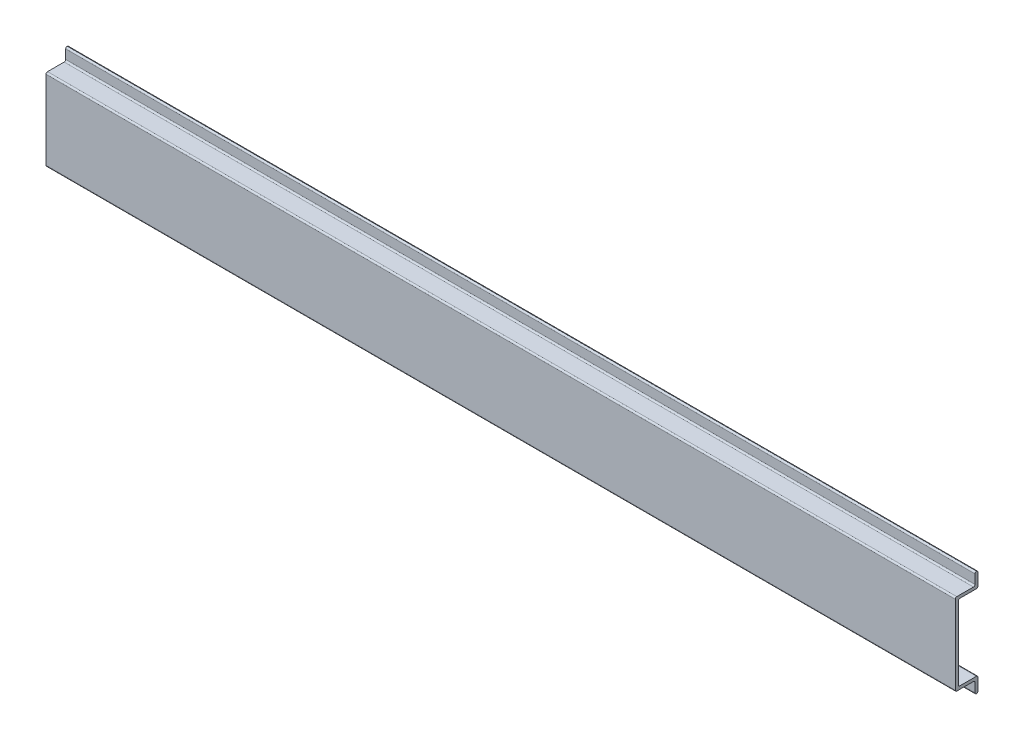
ISO-10303-21;
HEADER;
FILE_DESCRIPTION(('STEP AP214'),'2;1');
FILE_NAME('part.step','',(''),(''),'','','');
FILE_SCHEMA(('AUTOMOTIVE_DESIGN { 1 0 10303 214 1 1 1 1 }'));
ENDSEC;
DATA;
#1=APPLICATION_CONTEXT('core data for automotive mechanical design processes');
#2=APPLICATION_PROTOCOL_DEFINITION('international standard','automotive_design',2000,#1);
#3=PRODUCT_CONTEXT('',#1,'mechanical');
#4=PRODUCT('Part','Part','',(#3));
#5=PRODUCT_RELATED_PRODUCT_CATEGORY('part','',(#4));
#6=PRODUCT_DEFINITION_FORMATION('','',#4);
#7=PRODUCT_DEFINITION_CONTEXT('part definition',#1,'design');
#8=PRODUCT_DEFINITION('design','',#6,#7);
#9=PRODUCT_DEFINITION_SHAPE('','',#8);
#10=(LENGTH_UNIT() NAMED_UNIT(*) SI_UNIT(.MILLI.,.METRE.));
#11=(NAMED_UNIT(*) PLANE_ANGLE_UNIT() SI_UNIT($,.RADIAN.));
#12=(NAMED_UNIT(*) SI_UNIT($,.STERADIAN.) SOLID_ANGLE_UNIT());
#13=UNCERTAINTY_MEASURE_WITH_UNIT(LENGTH_MEASURE(1.E-05),#10,'distance_accuracy_value','');
#14=(GEOMETRIC_REPRESENTATION_CONTEXT(3) GLOBAL_UNCERTAINTY_ASSIGNED_CONTEXT((#13)) GLOBAL_UNIT_ASSIGNED_CONTEXT((#10,
#11,#12)) REPRESENTATION_CONTEXT('',''));
#15=CARTESIAN_POINT('',(0.,0.,0.));
#16=DIRECTION('',(0.,0.,1.));
#17=DIRECTION('',(1.,0.,0.));
#18=AXIS2_PLACEMENT_3D('',#15,#16,#17);
#19=CARTESIAN_POINT('',(-150.,0.,0.));
#20=DIRECTION('',(0.,0.,1.));
#21=DIRECTION('',(1.,0.,0.));
#22=AXIS2_PLACEMENT_3D('',#19,#20,#21);
#23=PLANE('',#22);
#24=DIRECTION('',(0.,-1.,0.));
#25=VECTOR('',#24,1.);
#26=CARTESIAN_POINT('',(-150.,-13.5,0.));
#27=LINE('',#26,#25);
#28=CARTESIAN_POINT('',(-150.,13.,0.));
#29=VERTEX_POINT('',#28);
#30=CARTESIAN_POINT('',(-150.,-13.,0.));
#31=VERTEX_POINT('',#30);
#32=EDGE_CURVE('E326',#29,#31,#27,.T.);
#33=ORIENTED_EDGE('',*,*,#32,.T.);
#34=DIRECTION('',(1.,0.,0.));
#35=VECTOR('',#34,1.);
#36=CARTESIAN_POINT('',(-150.,-13.,0.));
#37=LINE('',#36,#35);
#38=CARTESIAN_POINT('',(150.,-13.,0.));
#39=VERTEX_POINT('',#38);
#40=EDGE_CURVE('E197',#31,#39,#37,.T.);
#41=ORIENTED_EDGE('',*,*,#40,.T.);
#42=DIRECTION('',(0.,-1.,0.));
#43=VECTOR('',#42,1.);
#44=CARTESIAN_POINT('',(150.,-13.5,0.));
#45=LINE('',#44,#43);
#46=CARTESIAN_POINT('',(150.,13.,0.));
#47=VERTEX_POINT('',#46);
#48=EDGE_CURVE('E189',#47,#39,#45,.T.);
#49=ORIENTED_EDGE('',*,*,#48,.F.);
#50=DIRECTION('',(1.,0.,0.));
#51=VECTOR('',#50,1.);
#52=CARTESIAN_POINT('',(-150.,13.,0.));
#53=LINE('',#52,#51);
#54=EDGE_CURVE('E202',#47,#29,#53,.F.);
#55=ORIENTED_EDGE('',*,*,#54,.T.);
#56=EDGE_LOOP('',(#33,#41,#49,#55));
#57=FACE_BOUND('',#56,.T.);
#58=ADVANCED_FACE('F35',(#57),#23,.T.);
#59=CARTESIAN_POINT('',(-150.,13.5,0.));
#60=DIRECTION('',(0.,1.,0.));
#61=DIRECTION('',(0.,0.,1.));
#62=AXIS2_PLACEMENT_3D('',#59,#60,#61);
#63=PLANE('',#62);
#64=DIRECTION('',(0.,0.,1.));
#65=VECTOR('',#64,1.);
#66=CARTESIAN_POINT('',(-150.,13.5,0.));
#67=LINE('',#66,#65);
#68=CARTESIAN_POINT('',(-150.,13.5,-6.));
#69=VERTEX_POINT('',#68);
#70=CARTESIAN_POINT('',(-150.,13.5,-0.5));
#71=VERTEX_POINT('',#70);
#72=EDGE_CURVE('E211',#69,#71,#67,.T.);
#73=ORIENTED_EDGE('',*,*,#72,.T.);
#74=DIRECTION('',(1.,0.,0.));
#75=VECTOR('',#74,1.);
#76=CARTESIAN_POINT('',(-150.,13.5,-0.5));
#77=LINE('',#76,#75);
#78=CARTESIAN_POINT('',(150.,13.5,-0.5));
#79=VERTEX_POINT('',#78);
#80=EDGE_CURVE('E287',#71,#79,#77,.T.);
#81=ORIENTED_EDGE('',*,*,#80,.T.);
#82=DIRECTION('',(0.,0.,1.));
#83=VECTOR('',#82,1.);
#84=CARTESIAN_POINT('',(150.,13.5,0.));
#85=LINE('',#84,#83);
#86=CARTESIAN_POINT('',(150.,13.5,-6.));
#87=VERTEX_POINT('',#86);
#88=EDGE_CURVE('E191',#87,#79,#85,.T.);
#89=ORIENTED_EDGE('',*,*,#88,.F.);
#90=DIRECTION('',(1.,0.,0.));
#91=VECTOR('',#90,1.);
#92=CARTESIAN_POINT('',(-150.,13.5,-6.));
#93=LINE('',#92,#91);
#94=EDGE_CURVE('E285',#87,#69,#93,.F.);
#95=ORIENTED_EDGE('',*,*,#94,.T.);
#96=EDGE_LOOP('',(#73,#81,#89,#95));
#97=FACE_BOUND('',#96,.T.);
#98=ADVANCED_FACE('F356',(#97),#63,.T.);
#99=CARTESIAN_POINT('',(-150.,13.5,-6.5));
#100=DIRECTION('',(0.,0.,1.));
#101=DIRECTION('',(1.,0.,0.));
#102=AXIS2_PLACEMENT_3D('',#99,#100,#101);
#103=PLANE('',#102);
#104=DIRECTION('',(0.,-1.,0.));
#105=VECTOR('',#104,1.);
#106=CARTESIAN_POINT('',(150.,13.5,-6.5));
#107=LINE('',#106,#105);
#108=CARTESIAN_POINT('',(150.,17.,-6.5));
#109=VERTEX_POINT('',#108);
#110=CARTESIAN_POINT('',(150.,14.,-6.5));
#111=VERTEX_POINT('',#110);
#112=EDGE_CURVE('E317',#109,#111,#107,.T.);
#113=ORIENTED_EDGE('',*,*,#112,.F.);
#114=DIRECTION('',(1.,0.,0.));
#115=VECTOR('',#114,1.);
#116=CARTESIAN_POINT('',(-150.,17.,-6.5));
#117=LINE('',#116,#115);
#118=CARTESIAN_POINT('',(-150.,17.,-6.5));
#119=VERTEX_POINT('',#118);
#120=EDGE_CURVE('E283',#109,#119,#117,.F.);
#121=ORIENTED_EDGE('',*,*,#120,.T.);
#122=DIRECTION('',(0.,-1.,0.));
#123=VECTOR('',#122,1.);
#124=CARTESIAN_POINT('',(-150.,13.5,-6.5));
#125=LINE('',#124,#123);
#126=CARTESIAN_POINT('',(-150.,14.,-6.5));
#127=VERTEX_POINT('',#126);
#128=EDGE_CURVE('E215',#119,#127,#125,.T.);
#129=ORIENTED_EDGE('',*,*,#128,.T.);
#130=DIRECTION('',(1.,0.,0.));
#131=VECTOR('',#130,1.);
#132=CARTESIAN_POINT('',(150.,14.,-6.5));
#133=LINE('',#132,#131);
#134=EDGE_CURVE('E280',#127,#111,#133,.T.);
#135=ORIENTED_EDGE('',*,*,#134,.T.);
#136=EDGE_LOOP('',(#113,#121,#129,#135));
#137=FACE_BOUND('',#136,.T.);
#138=ADVANCED_FACE('F320',(#137),#103,.T.);
#139=CARTESIAN_POINT('',(-150.,17.5,-7.5));
#140=DIRECTION('',(0.,0.,-1.));
#141=DIRECTION('',(-1.,0.,0.));
#142=AXIS2_PLACEMENT_3D('',#139,#140,#141);
#143=PLANE('',#142);
#144=DIRECTION('',(0.,1.,0.));
#145=VECTOR('',#144,1.);
#146=CARTESIAN_POINT('',(150.,17.5,-7.5));
#147=LINE('',#146,#145);
#148=CARTESIAN_POINT('',(150.,13.,-7.5));
#149=VERTEX_POINT('',#148);
#150=CARTESIAN_POINT('',(150.,17.,-7.5));
#151=VERTEX_POINT('',#150);
#152=EDGE_CURVE('E324',#149,#151,#147,.T.);
#153=ORIENTED_EDGE('',*,*,#152,.F.);
#154=DIRECTION('',(1.,0.,0.));
#155=VECTOR('',#154,1.);
#156=CARTESIAN_POINT('',(-150.,13.,-7.5));
#157=LINE('',#156,#155);
#158=CARTESIAN_POINT('',(-150.,13.,-7.5));
#159=VERTEX_POINT('',#158);
#160=EDGE_CURVE('E278',#149,#159,#157,.F.);
#161=ORIENTED_EDGE('',*,*,#160,.T.);
#162=DIRECTION('',(0.,1.,0.));
#163=VECTOR('',#162,1.);
#164=CARTESIAN_POINT('',(-150.,17.5,-7.5));
#165=LINE('',#164,#163);
#166=CARTESIAN_POINT('',(-150.,17.,-7.5));
#167=VERTEX_POINT('',#166);
#168=EDGE_CURVE('E350',#159,#167,#165,.T.);
#169=ORIENTED_EDGE('',*,*,#168,.T.);
#170=DIRECTION('',(1.,0.,0.));
#171=VECTOR('',#170,1.);
#172=CARTESIAN_POINT('',(-150.,17.,-7.5));
#173=LINE('',#172,#171);
#174=EDGE_CURVE('E275',#167,#151,#173,.T.);
#175=ORIENTED_EDGE('',*,*,#174,.T.);
#176=EDGE_LOOP('',(#153,#161,#169,#175));
#177=FACE_BOUND('',#176,.T.);
#178=ADVANCED_FACE('F447',(#177),#143,.T.);
#179=CARTESIAN_POINT('',(-150.,12.5,-7.5));
#180=DIRECTION('',(0.,-1.,0.));
#181=DIRECTION('',(0.,0.,-1.));
#182=AXIS2_PLACEMENT_3D('',#179,#180,#181);
#183=PLANE('',#182);
#184=DIRECTION('',(0.,0.,-1.));
#185=VECTOR('',#184,1.);
#186=CARTESIAN_POINT('',(150.,12.5,-7.5));
#187=LINE('',#186,#185);
#188=CARTESIAN_POINT('',(150.,12.5,-1.5));
#189=VERTEX_POINT('',#188);
#190=CARTESIAN_POINT('',(150.,12.5,-7.));
#191=VERTEX_POINT('',#190);
#192=EDGE_CURVE('E328',#189,#191,#187,.T.);
#193=ORIENTED_EDGE('',*,*,#192,.F.);
#194=DIRECTION('',(1.,0.,0.));
#195=VECTOR('',#194,1.);
#196=CARTESIAN_POINT('',(-150.,12.5,-1.5));
#197=LINE('',#196,#195);
#198=CARTESIAN_POINT('',(-150.,12.5,-1.5));
#199=VERTEX_POINT('',#198);
#200=EDGE_CURVE('E273',#189,#199,#197,.F.);
#201=ORIENTED_EDGE('',*,*,#200,.T.);
#202=DIRECTION('',(0.,0.,-1.));
#203=VECTOR('',#202,1.);
#204=CARTESIAN_POINT('',(-150.,12.5,-7.5));
#205=LINE('',#204,#203);
#206=CARTESIAN_POINT('',(-150.,12.5,-7.));
#207=VERTEX_POINT('',#206);
#208=EDGE_CURVE('E347',#199,#207,#205,.T.);
#209=ORIENTED_EDGE('',*,*,#208,.T.);
#210=DIRECTION('',(1.,0.,0.));
#211=VECTOR('',#210,1.);
#212=CARTESIAN_POINT('',(-150.,12.5,-7.));
#213=LINE('',#212,#211);
#214=EDGE_CURVE('E270',#207,#191,#213,.T.);
#215=ORIENTED_EDGE('',*,*,#214,.T.);
#216=EDGE_LOOP('',(#193,#201,#209,#215));
#217=FACE_BOUND('',#216,.T.);
#218=ADVANCED_FACE('F387',(#217),#183,.T.);
#219=CARTESIAN_POINT('',(-150.,12.5,-1.));
#220=DIRECTION('',(0.,0.,-1.));
#221=DIRECTION('',(0.,1.,0.));
#222=AXIS2_PLACEMENT_3D('',#219,#220,#221);
#223=PLANE('',#222);
#224=DIRECTION('',(0.,1.,0.));
#225=VECTOR('',#224,1.);
#226=CARTESIAN_POINT('',(150.,12.5,-1.));
#227=LINE('',#226,#225);
#228=CARTESIAN_POINT('',(150.,-12.,-1.));
#229=VERTEX_POINT('',#228);
#230=CARTESIAN_POINT('',(150.,12.,-1.));
#231=VERTEX_POINT('',#230);
#232=EDGE_CURVE('E380',#229,#231,#227,.T.);
#233=ORIENTED_EDGE('',*,*,#232,.F.);
#234=DIRECTION('',(1.,0.,0.));
#235=VECTOR('',#234,1.);
#236=CARTESIAN_POINT('',(-150.,-12.,-1.));
#237=LINE('',#236,#235);
#238=CARTESIAN_POINT('',(-150.,-12.,-1.));
#239=VERTEX_POINT('',#238);
#240=EDGE_CURVE('E268',#229,#239,#237,.F.);
#241=ORIENTED_EDGE('',*,*,#240,.T.);
#242=DIRECTION('',(0.,1.,0.));
#243=VECTOR('',#242,1.);
#244=CARTESIAN_POINT('',(-150.,12.5,-1.));
#245=LINE('',#244,#243);
#246=CARTESIAN_POINT('',(-150.,12.,-1.));
#247=VERTEX_POINT('',#246);
#248=EDGE_CURVE('E344',#239,#247,#245,.T.);
#249=ORIENTED_EDGE('',*,*,#248,.T.);
#250=DIRECTION('',(1.,0.,0.));
#251=VECTOR('',#250,1.);
#252=CARTESIAN_POINT('',(150.,12.,-1.));
#253=LINE('',#252,#251);
#254=EDGE_CURVE('E265',#247,#231,#253,.T.);
#255=ORIENTED_EDGE('',*,*,#254,.T.);
#256=EDGE_LOOP('',(#233,#241,#249,#255));
#257=FACE_BOUND('',#256,.T.);
#258=ADVANCED_FACE('F398',(#257),#223,.T.);
#259=CARTESIAN_POINT('',(-150.,-12.5,-1.));
#260=DIRECTION('',(0.,1.,0.));
#261=DIRECTION('',(0.,0.,1.));
#262=AXIS2_PLACEMENT_3D('',#259,#260,#261);
#263=PLANE('',#262);
#264=DIRECTION('',(0.,0.,1.));
#265=VECTOR('',#264,1.);
#266=CARTESIAN_POINT('',(150.,-12.5,-1.));
#267=LINE('',#266,#265);
#268=CARTESIAN_POINT('',(150.,-12.5,-7.));
#269=VERTEX_POINT('',#268);
#270=CARTESIAN_POINT('',(150.,-12.5,-1.5));
#271=VERTEX_POINT('',#270);
#272=EDGE_CURVE('E377',#269,#271,#267,.T.);
#273=ORIENTED_EDGE('',*,*,#272,.F.);
#274=DIRECTION('',(1.,0.,0.));
#275=VECTOR('',#274,1.);
#276=CARTESIAN_POINT('',(-150.,-12.5,-7.));
#277=LINE('',#276,#275);
#278=CARTESIAN_POINT('',(-150.,-12.5,-7.));
#279=VERTEX_POINT('',#278);
#280=EDGE_CURVE('E263',#269,#279,#277,.F.);
#281=ORIENTED_EDGE('',*,*,#280,.T.);
#282=DIRECTION('',(0.,0.,1.));
#283=VECTOR('',#282,1.);
#284=CARTESIAN_POINT('',(-150.,-12.5,-1.));
#285=LINE('',#284,#283);
#286=CARTESIAN_POINT('',(-150.,-12.5,-1.5));
#287=VERTEX_POINT('',#286);
#288=EDGE_CURVE('E341',#279,#287,#285,.T.);
#289=ORIENTED_EDGE('',*,*,#288,.T.);
#290=DIRECTION('',(1.,0.,0.));
#291=VECTOR('',#290,1.);
#292=CARTESIAN_POINT('',(150.,-12.5,-1.5));
#293=LINE('',#292,#291);
#294=EDGE_CURVE('E260',#287,#271,#293,.T.);
#295=ORIENTED_EDGE('',*,*,#294,.T.);
#296=EDGE_LOOP('',(#273,#281,#289,#295));
#297=FACE_BOUND('',#296,.T.);
#298=ADVANCED_FACE('F407',(#297),#263,.T.);
#299=CARTESIAN_POINT('',(-150.,-12.5,-7.5));
#300=DIRECTION('',(0.,0.,-1.));
#301=DIRECTION('',(-1.,0.,0.));
#302=AXIS2_PLACEMENT_3D('',#299,#300,#301);
#303=PLANE('',#302);
#304=DIRECTION('',(0.,1.,0.));
#305=VECTOR('',#304,1.);
#306=CARTESIAN_POINT('',(150.,-12.5,-7.5));
#307=LINE('',#306,#305);
#308=CARTESIAN_POINT('',(150.,-17.,-7.5));
#309=VERTEX_POINT('',#308);
#310=CARTESIAN_POINT('',(150.,-13.,-7.5));
#311=VERTEX_POINT('',#310);
#312=EDGE_CURVE('E372',#309,#311,#307,.T.);
#313=ORIENTED_EDGE('',*,*,#312,.F.);
#314=DIRECTION('',(1.,0.,0.));
#315=VECTOR('',#314,1.);
#316=CARTESIAN_POINT('',(-150.,-17.,-7.5));
#317=LINE('',#316,#315);
#318=CARTESIAN_POINT('',(-150.,-17.,-7.5));
#319=VERTEX_POINT('',#318);
#320=EDGE_CURVE('E258',#309,#319,#317,.F.);
#321=ORIENTED_EDGE('',*,*,#320,.T.);
#322=DIRECTION('',(0.,1.,0.));
#323=VECTOR('',#322,1.);
#324=CARTESIAN_POINT('',(-150.,-12.5,-7.5));
#325=LINE('',#324,#323);
#326=CARTESIAN_POINT('',(-150.,-13.,-7.5));
#327=VERTEX_POINT('',#326);
#328=EDGE_CURVE('E338',#319,#327,#325,.T.);
#329=ORIENTED_EDGE('',*,*,#328,.T.);
#330=DIRECTION('',(1.,0.,0.));
#331=VECTOR('',#330,1.);
#332=CARTESIAN_POINT('',(-150.,-13.,-7.5));
#333=LINE('',#332,#331);
#334=EDGE_CURVE('E255',#327,#311,#333,.T.);
#335=ORIENTED_EDGE('',*,*,#334,.T.);
#336=EDGE_LOOP('',(#313,#321,#329,#335));
#337=FACE_BOUND('',#336,.T.);
#338=ADVANCED_FACE('F416',(#337),#303,.T.);
#339=CARTESIAN_POINT('',(-150.,-17.5,-6.5));
#340=DIRECTION('',(0.,0.,1.));
#341=DIRECTION('',(0.,-1.,0.));
#342=AXIS2_PLACEMENT_3D('',#339,#340,#341);
#343=PLANE('',#342);
#344=DIRECTION('',(0.,-1.,0.));
#345=VECTOR('',#344,1.);
#346=CARTESIAN_POINT('',(150.,-17.5,-6.5));
#347=LINE('',#346,#345);
#348=CARTESIAN_POINT('',(150.,-14.,-6.5));
#349=VERTEX_POINT('',#348);
#350=CARTESIAN_POINT('',(150.,-17.,-6.5));
#351=VERTEX_POINT('',#350);
#352=EDGE_CURVE('E369',#349,#351,#347,.T.);
#353=ORIENTED_EDGE('',*,*,#352,.F.);
#354=DIRECTION('',(1.,0.,0.));
#355=VECTOR('',#354,1.);
#356=CARTESIAN_POINT('',(-150.,-14.,-6.5));
#357=LINE('',#356,#355);
#358=CARTESIAN_POINT('',(-150.,-14.,-6.5));
#359=VERTEX_POINT('',#358);
#360=EDGE_CURVE('E59',#349,#359,#357,.F.);
#361=ORIENTED_EDGE('',*,*,#360,.T.);
#362=DIRECTION('',(0.,-1.,0.));
#363=VECTOR('',#362,1.);
#364=CARTESIAN_POINT('',(-150.,-17.5,-6.5));
#365=LINE('',#364,#363);
#366=CARTESIAN_POINT('',(-150.,-17.,-6.5));
#367=VERTEX_POINT('',#366);
#368=EDGE_CURVE('E336',#359,#367,#365,.T.);
#369=ORIENTED_EDGE('',*,*,#368,.T.);
#370=DIRECTION('',(1.,0.,0.));
#371=VECTOR('',#370,1.);
#372=CARTESIAN_POINT('',(-150.,-17.,-6.5));
#373=LINE('',#372,#371);
#374=EDGE_CURVE('E251',#367,#351,#373,.T.);
#375=ORIENTED_EDGE('',*,*,#374,.T.);
#376=EDGE_LOOP('',(#353,#361,#369,#375));
#377=FACE_BOUND('',#376,.T.);
#378=ADVANCED_FACE('F423',(#377),#343,.T.);
#379=CARTESIAN_POINT('',(-150.,-13.5,-6.5));
#380=DIRECTION('',(0.,-1.,0.));
#381=DIRECTION('',(0.,0.,-1.));
#382=AXIS2_PLACEMENT_3D('',#379,#380,#381);
#383=PLANE('',#382);
#384=DIRECTION('',(0.,0.,-1.));
#385=VECTOR('',#384,1.);
#386=CARTESIAN_POINT('',(150.,-13.5,-6.5));
#387=LINE('',#386,#385);
#388=CARTESIAN_POINT('',(150.,-13.5,-0.5));
#389=VERTEX_POINT('',#388);
#390=CARTESIAN_POINT('',(150.,-13.5,-6.));
#391=VERTEX_POINT('',#390);
#392=EDGE_CURVE('E205',#389,#391,#387,.T.);
#393=ORIENTED_EDGE('',*,*,#392,.F.);
#394=DIRECTION('',(1.,0.,0.));
#395=VECTOR('',#394,1.);
#396=CARTESIAN_POINT('',(-150.,-13.5,-0.5));
#397=LINE('',#396,#395);
#398=CARTESIAN_POINT('',(-150.,-13.5,-0.5));
#399=VERTEX_POINT('',#398);
#400=EDGE_CURVE('E235',#389,#399,#397,.F.);
#401=ORIENTED_EDGE('',*,*,#400,.T.);
#402=DIRECTION('',(0.,0.,-1.));
#403=VECTOR('',#402,1.);
#404=CARTESIAN_POINT('',(-150.,-13.5,-6.5));
#405=LINE('',#404,#403);
#406=CARTESIAN_POINT('',(-150.,-13.5,-6.));
#407=VERTEX_POINT('',#406);
#408=EDGE_CURVE('E333',#399,#407,#405,.T.);
#409=ORIENTED_EDGE('',*,*,#408,.T.);
#410=DIRECTION('',(1.,0.,0.));
#411=VECTOR('',#410,1.);
#412=CARTESIAN_POINT('',(150.,-13.5,-6.));
#413=LINE('',#412,#411);
#414=EDGE_CURVE('E232',#407,#391,#413,.T.);
#415=ORIENTED_EDGE('',*,*,#414,.T.);
#416=EDGE_LOOP('',(#393,#401,#409,#415));
#417=FACE_BOUND('',#416,.T.);
#418=ADVANCED_FACE('F367',(#417),#383,.T.);
#419=CARTESIAN_POINT('',(-150.,0.,0.));
#420=DIRECTION('',(-1.,0.,0.));
#421=DIRECTION('',(0.,0.,1.));
#422=AXIS2_PLACEMENT_3D('',#419,#420,#421);
#423=PLANE('',#422);
#424=ORIENTED_EDGE('',*,*,#408,.F.);
#425=CARTESIAN_POINT('',(-150.,-13.,-0.5));
#426=DIRECTION('',(-1.,0.,0.));
#427=DIRECTION('',(0.,0.,1.));
#428=AXIS2_PLACEMENT_3D('',#425,#426,#427);
#429=CIRCLE('',#428,0.5);
#430=EDGE_CURVE('E249',#399,#31,#429,.T.);
#431=ORIENTED_EDGE('',*,*,#430,.T.);
#432=ORIENTED_EDGE('',*,*,#32,.F.);
#433=CARTESIAN_POINT('',(-150.,13.,-0.5));
#434=DIRECTION('',(-1.,0.,0.));
#435=DIRECTION('',(0.,0.,1.));
#436=AXIS2_PLACEMENT_3D('',#433,#434,#435);
#437=CIRCLE('',#436,0.5);
#438=EDGE_CURVE('E210',#29,#71,#437,.T.);
#439=ORIENTED_EDGE('',*,*,#438,.T.);
#440=ORIENTED_EDGE('',*,*,#72,.F.);
#441=CARTESIAN_POINT('',(-150.,14.,-6.));
#442=DIRECTION('',(-1.,0.,0.));
#443=DIRECTION('',(0.,0.,1.));
#444=AXIS2_PLACEMENT_3D('',#441,#442,#443);
#445=CIRCLE('',#444,0.5);
#446=EDGE_CURVE('E11',#69,#127,#445,.F.);
#447=ORIENTED_EDGE('',*,*,#446,.T.);
#448=ORIENTED_EDGE('',*,*,#128,.F.);
#449=CARTESIAN_POINT('',(-150.,17.,-7.));
#450=DIRECTION('',(-1.,0.,0.));
#451=DIRECTION('',(0.,0.,1.));
#452=AXIS2_PLACEMENT_3D('',#449,#450,#451);
#453=CIRCLE('',#452,0.5);
#454=CARTESIAN_POINT('',(-150.,17.5,-7.));
#455=VERTEX_POINT('',#454);
#456=EDGE_CURVE('E238',#119,#455,#453,.T.);
#457=ORIENTED_EDGE('',*,*,#456,.T.);
#458=CARTESIAN_POINT('',(-150.,17.,-7.));
#459=DIRECTION('',(-1.,0.,0.));
#460=DIRECTION('',(0.,0.,1.));
#461=AXIS2_PLACEMENT_3D('',#458,#459,#460);
#462=CIRCLE('',#461,0.5);
#463=EDGE_CURVE('E240',#455,#167,#462,.T.);
#464=ORIENTED_EDGE('',*,*,#463,.T.);
#465=ORIENTED_EDGE('',*,*,#168,.F.);
#466=CARTESIAN_POINT('',(-150.,13.,-7.));
#467=DIRECTION('',(-1.,0.,0.));
#468=DIRECTION('',(0.,0.,1.));
#469=AXIS2_PLACEMENT_3D('',#466,#467,#468);
#470=CIRCLE('',#469,0.5);
#471=EDGE_CURVE('E242',#159,#207,#470,.T.);
#472=ORIENTED_EDGE('',*,*,#471,.T.);
#473=ORIENTED_EDGE('',*,*,#208,.F.);
#474=CARTESIAN_POINT('',(-150.,12.,-1.5));
#475=DIRECTION('',(-1.,0.,0.));
#476=DIRECTION('',(0.,0.,1.));
#477=AXIS2_PLACEMENT_3D('',#474,#475,#476);
#478=CIRCLE('',#477,0.5);
#479=EDGE_CURVE('E299',#199,#247,#478,.F.);
#480=ORIENTED_EDGE('',*,*,#479,.T.);
#481=ORIENTED_EDGE('',*,*,#248,.F.);
#482=CARTESIAN_POINT('',(-150.,-12.,-1.5));
#483=DIRECTION('',(-1.,0.,0.));
#484=DIRECTION('',(0.,0.,1.));
#485=AXIS2_PLACEMENT_3D('',#482,#483,#484);
#486=CIRCLE('',#485,0.5);
#487=EDGE_CURVE('E295',#239,#287,#486,.F.);
#488=ORIENTED_EDGE('',*,*,#487,.T.);
#489=ORIENTED_EDGE('',*,*,#288,.F.);
#490=CARTESIAN_POINT('',(-150.,-13.,-7.));
#491=DIRECTION('',(-1.,0.,0.));
#492=DIRECTION('',(0.,0.,1.));
#493=AXIS2_PLACEMENT_3D('',#490,#491,#492);
#494=CIRCLE('',#493,0.5);
#495=EDGE_CURVE('E244',#279,#327,#494,.T.);
#496=ORIENTED_EDGE('',*,*,#495,.T.);
#497=ORIENTED_EDGE('',*,*,#328,.F.);
#498=CARTESIAN_POINT('',(-150.,-17.,-7.));
#499=DIRECTION('',(-1.,0.,0.));
#500=DIRECTION('',(0.,0.,1.));
#501=AXIS2_PLACEMENT_3D('',#498,#499,#500);
#502=CIRCLE('',#501,0.5);
#503=CARTESIAN_POINT('',(-150.,-17.5,-7.));
#504=VERTEX_POINT('',#503);
#505=EDGE_CURVE('E246',#319,#504,#502,.T.);
#506=ORIENTED_EDGE('',*,*,#505,.T.);
#507=CARTESIAN_POINT('',(-150.,-17.,-7.));
#508=DIRECTION('',(-1.,0.,0.));
#509=DIRECTION('',(0.,0.,1.));
#510=AXIS2_PLACEMENT_3D('',#507,#508,#509);
#511=CIRCLE('',#510,0.5);
#512=EDGE_CURVE('E52',#504,#367,#511,.T.);
#513=ORIENTED_EDGE('',*,*,#512,.T.);
#514=ORIENTED_EDGE('',*,*,#368,.F.);
#515=CARTESIAN_POINT('',(-150.,-14.,-6.));
#516=DIRECTION('',(-1.,0.,0.));
#517=DIRECTION('',(0.,0.,1.));
#518=AXIS2_PLACEMENT_3D('',#515,#516,#517);
#519=CIRCLE('',#518,0.5);
#520=EDGE_CURVE('E291',#359,#407,#519,.F.);
#521=ORIENTED_EDGE('',*,*,#520,.T.);
#522=EDGE_LOOP('',(#424,#431,#432,#439,#440,#447,#448,#457,#464,#465,#472,#473,#480,#481,#488,
#489,#496,#497,#506,#513,#514,#521));
#523=FACE_BOUND('',#522,.T.);
#524=ADVANCED_FACE('F359',(#523),#423,.T.);
#525=CARTESIAN_POINT('',(150.,0.,0.));
#526=DIRECTION('',(-1.,0.,0.));
#527=DIRECTION('',(0.,0.,1.));
#528=AXIS2_PLACEMENT_3D('',#525,#526,#527);
#529=PLANE('',#528);
#530=ORIENTED_EDGE('',*,*,#48,.T.);
#531=CARTESIAN_POINT('',(150.,-13.,-0.5));
#532=DIRECTION('',(-1.,0.,0.));
#533=DIRECTION('',(0.,0.,1.));
#534=AXIS2_PLACEMENT_3D('',#531,#532,#533);
#535=CIRCLE('',#534,0.5);
#536=EDGE_CURVE('E230',#39,#389,#535,.F.);
#537=ORIENTED_EDGE('',*,*,#536,.T.);
#538=ORIENTED_EDGE('',*,*,#392,.T.);
#539=CARTESIAN_POINT('',(150.,-14.,-6.));
#540=DIRECTION('',(-1.,0.,0.));
#541=DIRECTION('',(0.,0.,1.));
#542=AXIS2_PLACEMENT_3D('',#539,#540,#541);
#543=CIRCLE('',#542,0.5);
#544=EDGE_CURVE('E289',#391,#349,#543,.T.);
#545=ORIENTED_EDGE('',*,*,#544,.T.);
#546=ORIENTED_EDGE('',*,*,#352,.T.);
#547=CARTESIAN_POINT('',(150.,-17.,-7.));
#548=DIRECTION('',(-1.,0.,0.));
#549=DIRECTION('',(0.,0.,1.));
#550=AXIS2_PLACEMENT_3D('',#547,#548,#549);
#551=CIRCLE('',#550,0.5);
#552=CARTESIAN_POINT('',(150.,-17.5,-7.));
#553=VERTEX_POINT('',#552);
#554=EDGE_CURVE('E228',#351,#553,#551,.F.);
#555=ORIENTED_EDGE('',*,*,#554,.T.);
#556=CARTESIAN_POINT('',(150.,-17.,-7.));
#557=DIRECTION('',(-1.,0.,0.));
#558=DIRECTION('',(0.,0.,1.));
#559=AXIS2_PLACEMENT_3D('',#556,#557,#558);
#560=CIRCLE('',#559,0.5);
#561=EDGE_CURVE('E226',#553,#309,#560,.F.);
#562=ORIENTED_EDGE('',*,*,#561,.T.);
#563=ORIENTED_EDGE('',*,*,#312,.T.);
#564=CARTESIAN_POINT('',(150.,-13.,-7.));
#565=DIRECTION('',(-1.,0.,0.));
#566=DIRECTION('',(0.,0.,1.));
#567=AXIS2_PLACEMENT_3D('',#564,#565,#566);
#568=CIRCLE('',#567,0.5);
#569=EDGE_CURVE('E224',#311,#269,#568,.F.);
#570=ORIENTED_EDGE('',*,*,#569,.T.);
#571=ORIENTED_EDGE('',*,*,#272,.T.);
#572=CARTESIAN_POINT('',(150.,-12.,-1.5));
#573=DIRECTION('',(-1.,0.,0.));
#574=DIRECTION('',(0.,0.,1.));
#575=AXIS2_PLACEMENT_3D('',#572,#573,#574);
#576=CIRCLE('',#575,0.5);
#577=EDGE_CURVE('E293',#271,#229,#576,.T.);
#578=ORIENTED_EDGE('',*,*,#577,.T.);
#579=ORIENTED_EDGE('',*,*,#232,.T.);
#580=CARTESIAN_POINT('',(150.,12.,-1.5));
#581=DIRECTION('',(-1.,0.,0.));
#582=DIRECTION('',(0.,0.,1.));
#583=AXIS2_PLACEMENT_3D('',#580,#581,#582);
#584=CIRCLE('',#583,0.5);
#585=EDGE_CURVE('E297',#231,#189,#584,.T.);
#586=ORIENTED_EDGE('',*,*,#585,.T.);
#587=ORIENTED_EDGE('',*,*,#192,.T.);
#588=CARTESIAN_POINT('',(150.,13.,-7.));
#589=DIRECTION('',(-1.,0.,0.));
#590=DIRECTION('',(0.,0.,1.));
#591=AXIS2_PLACEMENT_3D('',#588,#589,#590);
#592=CIRCLE('',#591,0.5);
#593=EDGE_CURVE('E222',#191,#149,#592,.F.);
#594=ORIENTED_EDGE('',*,*,#593,.T.);
#595=ORIENTED_EDGE('',*,*,#152,.T.);
#596=CARTESIAN_POINT('',(150.,17.,-7.));
#597=DIRECTION('',(-1.,0.,0.));
#598=DIRECTION('',(0.,0.,1.));
#599=AXIS2_PLACEMENT_3D('',#596,#597,#598);
#600=CIRCLE('',#599,0.5);
#601=CARTESIAN_POINT('',(150.,17.5,-7.));
#602=VERTEX_POINT('',#601);
#603=EDGE_CURVE('E220',#151,#602,#600,.F.);
#604=ORIENTED_EDGE('',*,*,#603,.T.);
#605=CARTESIAN_POINT('',(150.,17.,-7.));
#606=DIRECTION('',(-1.,0.,0.));
#607=DIRECTION('',(0.,0.,1.));
#608=AXIS2_PLACEMENT_3D('',#605,#606,#607);
#609=CIRCLE('',#608,0.5);
#610=EDGE_CURVE('E196',#602,#109,#609,.F.);
#611=ORIENTED_EDGE('',*,*,#610,.T.);
#612=ORIENTED_EDGE('',*,*,#112,.T.);
#613=CARTESIAN_POINT('',(150.,14.,-6.));
#614=DIRECTION('',(-1.,0.,0.));
#615=DIRECTION('',(0.,0.,1.));
#616=AXIS2_PLACEMENT_3D('',#613,#614,#615);
#617=CIRCLE('',#616,0.5);
#618=EDGE_CURVE('E44',#111,#87,#617,.T.);
#619=ORIENTED_EDGE('',*,*,#618,.T.);
#620=ORIENTED_EDGE('',*,*,#88,.T.);
#621=CARTESIAN_POINT('',(150.,13.,-0.5));
#622=DIRECTION('',(-1.,0.,0.));
#623=DIRECTION('',(0.,0.,1.));
#624=AXIS2_PLACEMENT_3D('',#621,#622,#623);
#625=CIRCLE('',#624,0.5);
#626=EDGE_CURVE('E186',#79,#47,#625,.F.);
#627=ORIENTED_EDGE('',*,*,#626,.T.);
#628=EDGE_LOOP('',(#530,#537,#538,#545,#546,#555,#562,#563,#570,#571,#578,#579,#586,#587,#594,
#595,#604,#611,#612,#619,#620,#627));
#629=FACE_BOUND('',#628,.T.);
#630=ADVANCED_FACE('F188',(#629),#529,.F.);
#631=CARTESIAN_POINT('',(-150.,-13.,-0.5));
#632=DIRECTION('',(1.,0.,0.));
#633=DIRECTION('',(0.,0.,-1.));
#634=AXIS2_PLACEMENT_3D('',#631,#632,#633);
#635=CYLINDRICAL_SURFACE('',#634,0.5);
#636=ORIENTED_EDGE('',*,*,#430,.F.);
#637=ORIENTED_EDGE('',*,*,#400,.F.);
#638=ORIENTED_EDGE('',*,*,#536,.F.);
#639=ORIENTED_EDGE('',*,*,#40,.F.);
#640=EDGE_LOOP('',(#636,#637,#638,#639));
#641=FACE_BOUND('',#640,.T.);
#642=ADVANCED_FACE('F362',(#641),#635,.T.);
#643=CARTESIAN_POINT('',(-150.,-14.,-6.));
#644=DIRECTION('',(-1.,0.,0.));
#645=DIRECTION('',(0.,0.,1.));
#646=AXIS2_PLACEMENT_3D('',#643,#644,#645);
#647=CYLINDRICAL_SURFACE('',#646,0.5);
#648=ORIENTED_EDGE('',*,*,#520,.F.);
#649=ORIENTED_EDGE('',*,*,#360,.F.);
#650=ORIENTED_EDGE('',*,*,#544,.F.);
#651=ORIENTED_EDGE('',*,*,#414,.F.);
#652=EDGE_LOOP('',(#648,#649,#650,#651));
#653=FACE_BOUND('',#652,.T.);
#654=ADVANCED_FACE('F426',(#653),#647,.F.);
#655=CARTESIAN_POINT('',(-150.,-17.,-7.));
#656=DIRECTION('',(1.,0.,0.));
#657=DIRECTION('',(0.,0.,-1.));
#658=AXIS2_PLACEMENT_3D('',#655,#656,#657);
#659=CYLINDRICAL_SURFACE('',#658,0.5);
#660=DIRECTION('',(1.,0.,0.));
#661=VECTOR('',#660,1.);
#662=CARTESIAN_POINT('',(-150.,-17.5,-7.));
#663=LINE('',#662,#661);
#664=EDGE_CURVE('E206',#504,#553,#663,.T.);
#665=ORIENTED_EDGE('',*,*,#664,.F.);
#666=ORIENTED_EDGE('',*,*,#505,.F.);
#667=ORIENTED_EDGE('',*,*,#320,.F.);
#668=ORIENTED_EDGE('',*,*,#561,.F.);
#669=EDGE_LOOP('',(#665,#666,#667,#668));
#670=FACE_BOUND('',#669,.T.);
#671=ADVANCED_FACE('F420',(#670),#659,.T.);
#672=CARTESIAN_POINT('',(-150.,-17.,-7.));
#673=DIRECTION('',(1.,0.,0.));
#674=DIRECTION('',(0.,0.,-1.));
#675=AXIS2_PLACEMENT_3D('',#672,#673,#674);
#676=CYLINDRICAL_SURFACE('',#675,0.5);
#677=ORIENTED_EDGE('',*,*,#512,.F.);
#678=ORIENTED_EDGE('',*,*,#664,.T.);
#679=ORIENTED_EDGE('',*,*,#554,.F.);
#680=ORIENTED_EDGE('',*,*,#374,.F.);
#681=EDGE_LOOP('',(#677,#678,#679,#680));
#682=FACE_BOUND('',#681,.T.);
#683=ADVANCED_FACE('F422',(#682),#676,.T.);
#684=CARTESIAN_POINT('',(-150.,-13.,-7.));
#685=DIRECTION('',(1.,0.,0.));
#686=DIRECTION('',(0.,0.,-1.));
#687=AXIS2_PLACEMENT_3D('',#684,#685,#686);
#688=CYLINDRICAL_SURFACE('',#687,0.5);
#689=ORIENTED_EDGE('',*,*,#495,.F.);
#690=ORIENTED_EDGE('',*,*,#280,.F.);
#691=ORIENTED_EDGE('',*,*,#569,.F.);
#692=ORIENTED_EDGE('',*,*,#334,.F.);
#693=EDGE_LOOP('',(#689,#690,#691,#692));
#694=FACE_BOUND('',#693,.T.);
#695=ADVANCED_FACE('F410',(#694),#688,.T.);
#696=CARTESIAN_POINT('',(-150.,-12.,-1.5));
#697=DIRECTION('',(-1.,0.,0.));
#698=DIRECTION('',(0.,0.,1.));
#699=AXIS2_PLACEMENT_3D('',#696,#697,#698);
#700=CYLINDRICAL_SURFACE('',#699,0.5);
#701=ORIENTED_EDGE('',*,*,#487,.F.);
#702=ORIENTED_EDGE('',*,*,#240,.F.);
#703=ORIENTED_EDGE('',*,*,#577,.F.);
#704=ORIENTED_EDGE('',*,*,#294,.F.);
#705=EDGE_LOOP('',(#701,#702,#703,#704));
#706=FACE_BOUND('',#705,.T.);
#707=ADVANCED_FACE('F401',(#706),#700,.F.);
#708=CARTESIAN_POINT('',(-150.,12.,-1.5));
#709=DIRECTION('',(-1.,0.,0.));
#710=DIRECTION('',(0.,0.,1.));
#711=AXIS2_PLACEMENT_3D('',#708,#709,#710);
#712=CYLINDRICAL_SURFACE('',#711,0.5);
#713=ORIENTED_EDGE('',*,*,#479,.F.);
#714=ORIENTED_EDGE('',*,*,#200,.F.);
#715=ORIENTED_EDGE('',*,*,#585,.F.);
#716=ORIENTED_EDGE('',*,*,#254,.F.);
#717=EDGE_LOOP('',(#713,#714,#715,#716));
#718=FACE_BOUND('',#717,.T.);
#719=ADVANCED_FACE('F392',(#718),#712,.F.);
#720=CARTESIAN_POINT('',(-150.,13.,-7.));
#721=DIRECTION('',(1.,0.,0.));
#722=DIRECTION('',(0.,0.,-1.));
#723=AXIS2_PLACEMENT_3D('',#720,#721,#722);
#724=CYLINDRICAL_SURFACE('',#723,0.5);
#725=ORIENTED_EDGE('',*,*,#471,.F.);
#726=ORIENTED_EDGE('',*,*,#160,.F.);
#727=ORIENTED_EDGE('',*,*,#593,.F.);
#728=ORIENTED_EDGE('',*,*,#214,.F.);
#729=EDGE_LOOP('',(#725,#726,#727,#728));
#730=FACE_BOUND('',#729,.T.);
#731=ADVANCED_FACE('F516',(#730),#724,.T.);
#732=CARTESIAN_POINT('',(-150.,17.,-7.));
#733=DIRECTION('',(1.,0.,0.));
#734=DIRECTION('',(0.,0.,-1.));
#735=AXIS2_PLACEMENT_3D('',#732,#733,#734);
#736=CYLINDRICAL_SURFACE('',#735,0.5);
#737=DIRECTION('',(1.,0.,0.));
#738=VECTOR('',#737,1.);
#739=CARTESIAN_POINT('',(-150.,17.5,-7.));
#740=LINE('',#739,#738);
#741=EDGE_CURVE('E39',#455,#602,#740,.T.);
#742=ORIENTED_EDGE('',*,*,#741,.F.);
#743=ORIENTED_EDGE('',*,*,#456,.F.);
#744=ORIENTED_EDGE('',*,*,#120,.F.);
#745=ORIENTED_EDGE('',*,*,#610,.F.);
#746=EDGE_LOOP('',(#742,#743,#744,#745));
#747=FACE_BOUND('',#746,.T.);
#748=ADVANCED_FACE('F313',(#747),#736,.T.);
#749=CARTESIAN_POINT('',(-150.,17.,-7.));
#750=DIRECTION('',(1.,0.,0.));
#751=DIRECTION('',(0.,0.,-1.));
#752=AXIS2_PLACEMENT_3D('',#749,#750,#751);
#753=CYLINDRICAL_SURFACE('',#752,0.5);
#754=ORIENTED_EDGE('',*,*,#463,.F.);
#755=ORIENTED_EDGE('',*,*,#741,.T.);
#756=ORIENTED_EDGE('',*,*,#603,.F.);
#757=ORIENTED_EDGE('',*,*,#174,.F.);
#758=EDGE_LOOP('',(#754,#755,#756,#757));
#759=FACE_BOUND('',#758,.T.);
#760=ADVANCED_FACE('F308',(#759),#753,.T.);
#761=CARTESIAN_POINT('',(-150.,13.,-0.5));
#762=DIRECTION('',(1.,0.,0.));
#763=DIRECTION('',(0.,0.,-1.));
#764=AXIS2_PLACEMENT_3D('',#761,#762,#763);
#765=CYLINDRICAL_SURFACE('',#764,0.5);
#766=ORIENTED_EDGE('',*,*,#438,.F.);
#767=ORIENTED_EDGE('',*,*,#54,.F.);
#768=ORIENTED_EDGE('',*,*,#626,.F.);
#769=ORIENTED_EDGE('',*,*,#80,.F.);
#770=EDGE_LOOP('',(#766,#767,#768,#769));
#771=FACE_BOUND('',#770,.T.);
#772=ADVANCED_FACE('F209',(#771),#765,.T.);
#773=CARTESIAN_POINT('',(-150.,14.,-6.));
#774=DIRECTION('',(-1.,0.,0.));
#775=DIRECTION('',(0.,0.,1.));
#776=AXIS2_PLACEMENT_3D('',#773,#774,#775);
#777=CYLINDRICAL_SURFACE('',#776,0.5);
#778=ORIENTED_EDGE('',*,*,#446,.F.);
#779=ORIENTED_EDGE('',*,*,#94,.F.);
#780=ORIENTED_EDGE('',*,*,#618,.F.);
#781=ORIENTED_EDGE('',*,*,#134,.F.);
#782=EDGE_LOOP('',(#778,#779,#780,#781));
#783=FACE_BOUND('',#782,.T.);
#784=ADVANCED_FACE('F37',(#783),#777,.F.);
#785=CLOSED_SHELL('',(#58,#98,#138,#178,#218,#258,#298,#338,#378,#418,#524,#630,#642,#654,#671,
#683,#695,#707,#719,#731,#748,#760,#772,#784));
#786=MANIFOLD_SOLID_BREP('B2',#785);
#787=ADVANCED_BREP_SHAPE_REPRESENTATION('',(#18,#786),#14);
#788=SHAPE_DEFINITION_REPRESENTATION(#9,#787);
ENDSEC;
END-ISO-10303-21;
